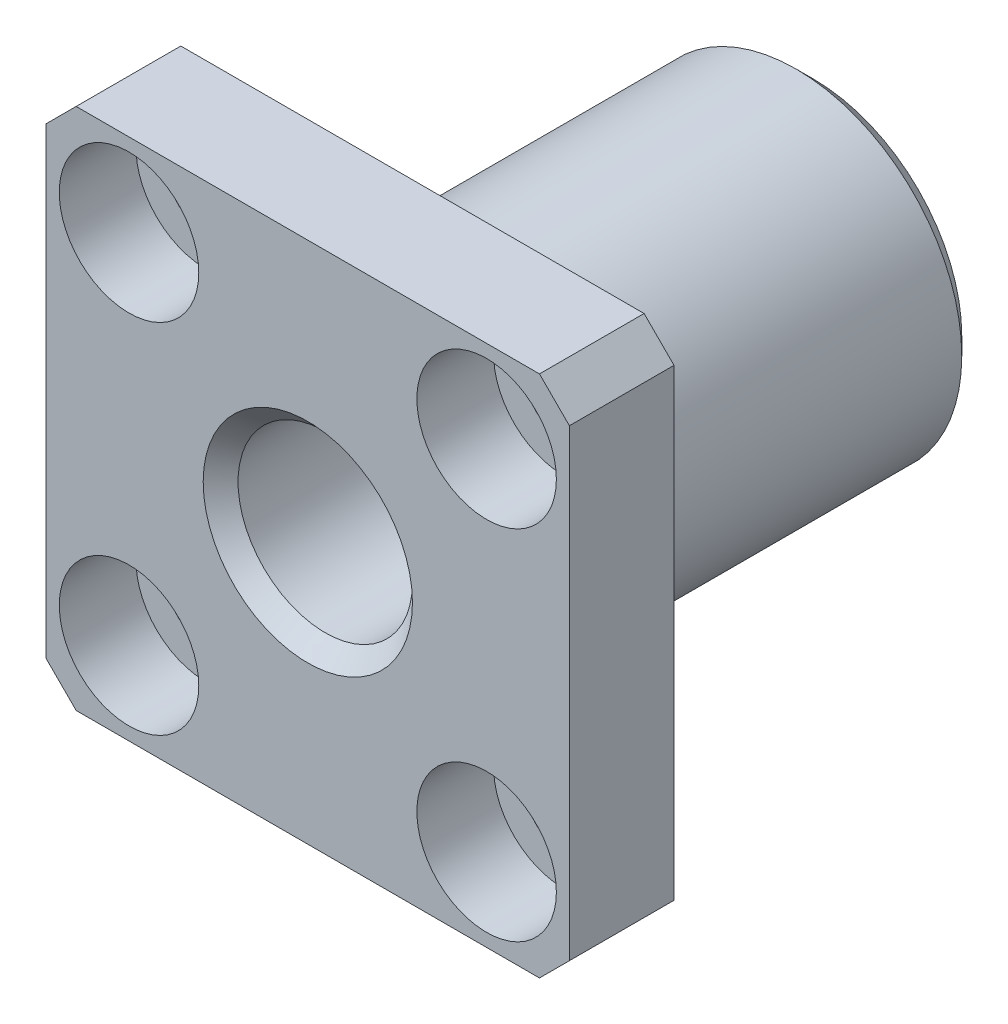
ISO-10303-21;
HEADER;
FILE_DESCRIPTION(('STEP AP214'),'2;1');
FILE_NAME('part.step','',(''),(''),'','','');
FILE_SCHEMA(('AUTOMOTIVE_DESIGN { 1 0 10303 214 1 1 1 1 }'));
ENDSEC;
DATA;
#1=APPLICATION_CONTEXT('core data for automotive mechanical design processes');
#2=APPLICATION_PROTOCOL_DEFINITION('international standard','automotive_design',2000,#1);
#3=PRODUCT_CONTEXT('',#1,'mechanical');
#4=PRODUCT('Part','Part','',(#3));
#5=PRODUCT_RELATED_PRODUCT_CATEGORY('part','',(#4));
#6=PRODUCT_DEFINITION_FORMATION('','',#4);
#7=PRODUCT_DEFINITION_CONTEXT('part definition',#1,'design');
#8=PRODUCT_DEFINITION('design','',#6,#7);
#9=PRODUCT_DEFINITION_SHAPE('','',#8);
#10=(LENGTH_UNIT() NAMED_UNIT(*) SI_UNIT(.MILLI.,.METRE.));
#11=(NAMED_UNIT(*) PLANE_ANGLE_UNIT() SI_UNIT($,.RADIAN.));
#12=(NAMED_UNIT(*) SI_UNIT($,.STERADIAN.) SOLID_ANGLE_UNIT());
#13=UNCERTAINTY_MEASURE_WITH_UNIT(LENGTH_MEASURE(1.E-05),#10,'distance_accuracy_value','');
#14=(GEOMETRIC_REPRESENTATION_CONTEXT(3) GLOBAL_UNCERTAINTY_ASSIGNED_CONTEXT((#13)) GLOBAL_UNIT_ASSIGNED_CONTEXT((#10,
#11,#12)) REPRESENTATION_CONTEXT('',''));
#15=CARTESIAN_POINT('',(0.,0.,0.));
#16=DIRECTION('',(0.,0.,1.));
#17=DIRECTION('',(1.,0.,0.));
#18=AXIS2_PLACEMENT_3D('',#15,#16,#17);
#19=CARTESIAN_POINT('',(0.,0.,29.));
#20=DIRECTION('',(0.,0.,-1.));
#21=DIRECTION('',(-1.,0.,0.));
#22=AXIS2_PLACEMENT_3D('',#19,#20,#21);
#23=CYLINDRICAL_SURFACE('',#22,9.5);
#24=CARTESIAN_POINT('',(0.,0.,1.00000000000004));
#25=DIRECTION('',(0.,0.,1.));
#26=DIRECTION('',(1.,0.,0.));
#27=AXIS2_PLACEMENT_3D('',#24,#25,#26);
#28=CIRCLE('',#27,9.5);
#29=CARTESIAN_POINT('',(-9.5,0.,1.00000000000004));
#30=VERTEX_POINT('',#29);
#31=EDGE_CURVE('E141',#30,#30,#28,.T.);
#32=CARTESIAN_POINT('',(0.,0.,23.));
#33=DIRECTION('',(0.,0.,-1.));
#34=DIRECTION('',(-1.,0.,0.));
#35=AXIS2_PLACEMENT_3D('',#32,#33,#34);
#36=CIRCLE('',#35,9.5);
#37=CARTESIAN_POINT('',(-9.5,0.,23.));
#38=VERTEX_POINT('',#37);
#39=EDGE_CURVE('E138',#38,#38,#36,.T.);
#40=CARTESIAN_POINT('',(-9.5,0.,1.00000000000004));
#41=CARTESIAN_POINT('',(-9.5,0.,1.2291666666667));
#42=CARTESIAN_POINT('',(-9.5,0.,1.45833333333337));
#43=CARTESIAN_POINT('',(-9.5,0.,1.9166666666667));
#44=CARTESIAN_POINT('',(-9.5,0.,2.14583333333337));
#45=CARTESIAN_POINT('',(-9.5,0.,2.6041666666667));
#46=CARTESIAN_POINT('',(-9.5,0.,2.83333333333337));
#47=CARTESIAN_POINT('',(-9.5,0.,3.2916666666667));
#48=CARTESIAN_POINT('',(-9.5,0.,3.52083333333337));
#49=CARTESIAN_POINT('',(-9.5,0.,3.9791666666667));
#50=CARTESIAN_POINT('',(-9.5,0.,4.20833333333337));
#51=CARTESIAN_POINT('',(-9.5,0.,4.6666666666667));
#52=CARTESIAN_POINT('',(-9.5,0.,4.89583333333337));
#53=CARTESIAN_POINT('',(-9.5,0.,5.3541666666667));
#54=CARTESIAN_POINT('',(-9.5,0.,5.58333333333336));
#55=CARTESIAN_POINT('',(-9.5,0.,6.0416666666667));
#56=CARTESIAN_POINT('',(-9.5,0.,6.27083333333336));
#57=CARTESIAN_POINT('',(-9.5,0.,6.72916666666669));
#58=CARTESIAN_POINT('',(-9.5,0.,6.95833333333336));
#59=CARTESIAN_POINT('',(-9.5,0.,7.41666666666669));
#60=CARTESIAN_POINT('',(-9.5,0.,7.64583333333336));
#61=CARTESIAN_POINT('',(-9.5,0.,8.10416666666669));
#62=CARTESIAN_POINT('',(-9.5,0.,8.33333333333336));
#63=CARTESIAN_POINT('',(-9.5,0.,8.79166666666669));
#64=CARTESIAN_POINT('',(-9.5,0.,9.02083333333336));
#65=CARTESIAN_POINT('',(-9.5,0.,9.47916666666669));
#66=CARTESIAN_POINT('',(-9.5,0.,9.70833333333336));
#67=CARTESIAN_POINT('',(-9.5,0.,10.1666666666667));
#68=CARTESIAN_POINT('',(-9.5,0.,10.3958333333334));
#69=CARTESIAN_POINT('',(-9.5,0.,10.8541666666667));
#70=CARTESIAN_POINT('',(-9.5,0.,11.0833333333334));
#71=CARTESIAN_POINT('',(-9.5,0.,11.5416666666667));
#72=CARTESIAN_POINT('',(-9.5,0.,11.7708333333334));
#73=CARTESIAN_POINT('',(-9.5,0.,12.2291666666667));
#74=CARTESIAN_POINT('',(-9.5,0.,12.4583333333334));
#75=CARTESIAN_POINT('',(-9.5,0.,12.9166666666667));
#76=CARTESIAN_POINT('',(-9.5,0.,13.1458333333334));
#77=CARTESIAN_POINT('',(-9.5,0.,13.6041666666667));
#78=CARTESIAN_POINT('',(-9.5,0.,13.8333333333333));
#79=CARTESIAN_POINT('',(-9.5,0.,14.2916666666667));
#80=CARTESIAN_POINT('',(-9.5,0.,14.5208333333333));
#81=CARTESIAN_POINT('',(-9.5,0.,14.9791666666667));
#82=CARTESIAN_POINT('',(-9.5,0.,15.2083333333333));
#83=CARTESIAN_POINT('',(-9.5,0.,15.6666666666667));
#84=CARTESIAN_POINT('',(-9.5,0.,15.8958333333333));
#85=CARTESIAN_POINT('',(-9.5,0.,16.3541666666667));
#86=CARTESIAN_POINT('',(-9.5,0.,16.5833333333333));
#87=CARTESIAN_POINT('',(-9.5,0.,17.0416666666667));
#88=CARTESIAN_POINT('',(-9.5,0.,17.2708333333333));
#89=CARTESIAN_POINT('',(-9.5,0.,17.7291666666667));
#90=CARTESIAN_POINT('',(-9.5,0.,17.9583333333333));
#91=CARTESIAN_POINT('',(-9.5,0.,18.4166666666667));
#92=CARTESIAN_POINT('',(-9.5,0.,18.6458333333333));
#93=CARTESIAN_POINT('',(-9.5,0.,19.1041666666667));
#94=CARTESIAN_POINT('',(-9.5,0.,19.3333333333333));
#95=CARTESIAN_POINT('',(-9.5,0.,19.7916666666667));
#96=CARTESIAN_POINT('',(-9.5,0.,20.0208333333333));
#97=CARTESIAN_POINT('',(-9.5,0.,20.4791666666667));
#98=CARTESIAN_POINT('',(-9.5,0.,20.7083333333333));
#99=CARTESIAN_POINT('',(-9.5,0.,21.1666666666667));
#100=CARTESIAN_POINT('',(-9.5,0.,21.3958333333333));
#101=CARTESIAN_POINT('',(-9.5,0.,21.8541666666667));
#102=CARTESIAN_POINT('',(-9.5,0.,22.0833333333333));
#103=CARTESIAN_POINT('',(-9.5,0.,22.5416666666667));
#104=CARTESIAN_POINT('',(-9.5,0.,22.7708333333333));
#105=CARTESIAN_POINT('',(-9.5,0.,23.));
#106=B_SPLINE_CURVE_WITH_KNOTS('',3,(#40,#41,#42,#43,#44,#45,#46,#47,#48,#49,#50,#51,#52,#53,
#54,#55,#56,#57,#58,#59,#60,#61,#62,#63,#64,#65,#66,#67,#68,#69,#70,#71,#72,#73,#74,#75,#76,#77,
#78,#79,#80,#81,#82,#83,#84,#85,#86,#87,#88,#89,#90,#91,#92,#93,#94,#95,#96,#97,#98,#99,#100,
#101,#102,#103,#104,#105),.UNSPECIFIED.,.F.,.F.,(4,2,2,2,2,2,2,2,2,2,2,2,2,2,2,2,2,2,2,2,2,2,2,
2,2,2,2,2,2,2,2,2,4),(0.,0.687500000000001,1.375,2.0625,2.75,3.4375,4.125,4.81249999999999,
5.49999999999999,6.18749999999999,6.87499999999999,7.56249999999999,8.24999999999999,
8.93749999999999,9.62499999999999,10.3125,11.,11.6875,12.375,13.0625,13.75,14.4375,15.125,
15.8125,16.5,17.1875,17.875,18.5625,19.25,19.9375,20.625,21.3125,22.),.UNSPECIFIED.);
#107=EDGE_CURVE('BSEAM33',#30,#38,#106,.T.);
#108=ORIENTED_EDGE('',*,*,#31,.T.);
#109=ORIENTED_EDGE('',*,*,#39,.T.);
#110=ORIENTED_EDGE('',*,*,#107,.T.);
#111=ORIENTED_EDGE('',*,*,#107,.F.);
#112=EDGE_LOOP('',(#108,#110,#109,#111));
#113=FACE_BOUND('',#112,.T.);
#114=ADVANCED_FACE('F33',(#113),#23,.T.);
#115=CARTESIAN_POINT('',(0.,0.,0.));
#116=DIRECTION('',(0.,0.,1.));
#117=DIRECTION('',(1.,0.,0.));
#118=AXIS2_PLACEMENT_3D('',#115,#116,#117);
#119=PLANE('',#118);
#120=CARTESIAN_POINT('',(0.,0.,0.));
#121=DIRECTION('',(0.,0.,1.));
#122=DIRECTION('',(1.,0.,0.));
#123=AXIS2_PLACEMENT_3D('',#120,#121,#122);
#124=CIRCLE('',#123,8.49999999999995);
#125=CARTESIAN_POINT('',(8.49999999999995,0.,0.));
#126=VERTEX_POINT('',#125);
#127=EDGE_CURVE('E164',#126,#126,#124,.F.);
#128=ORIENTED_EDGE('',*,*,#127,.T.);
#129=EDGE_LOOP('',(#128));
#130=FACE_BOUND('',#129,.T.);
#131=CARTESIAN_POINT('',(0.,0.,0.));
#132=DIRECTION('',(0.,0.,1.));
#133=DIRECTION('',(1.,0.,0.));
#134=AXIS2_PLACEMENT_3D('',#131,#132,#133);
#135=CIRCLE('',#134,5.);
#136=CARTESIAN_POINT('',(5.,0.,0.));
#137=VERTEX_POINT('',#136);
#138=EDGE_CURVE('E442',#137,#137,#135,.T.);
#139=ORIENTED_EDGE('',*,*,#138,.T.);
#140=EDGE_LOOP('',(#139));
#141=FACE_BOUND('',#140,.T.);
#142=ADVANCED_FACE('F181',(#130,#141),#119,.F.);
#143=CARTESIAN_POINT('',(15.,-15.,23.));
#144=DIRECTION('',(1.,0.,0.));
#145=DIRECTION('',(0.,0.,-1.));
#146=AXIS2_PLACEMENT_3D('',#143,#144,#145);
#147=PLANE('',#146);
#148=DIRECTION('',(0.,0.,1.));
#149=VECTOR('',#148,1.);
#150=CARTESIAN_POINT('',(15.,-13.2842712474619,0.));
#151=LINE('',#150,#149);
#152=CARTESIAN_POINT('',(15.,-13.2842712474619,23.));
#153=VERTEX_POINT('',#152);
#154=CARTESIAN_POINT('',(15.,-13.2842712474619,29.));
#155=VERTEX_POINT('',#154);
#156=EDGE_CURVE('E474',#153,#155,#151,.T.);
#157=ORIENTED_EDGE('',*,*,#156,.F.);
#158=DIRECTION('',(0.,1.,0.));
#159=VECTOR('',#158,1.);
#160=CARTESIAN_POINT('',(15.,-15.,23.));
#161=LINE('',#160,#159);
#162=CARTESIAN_POINT('',(15.,13.2842712474619,23.));
#163=VERTEX_POINT('',#162);
#164=EDGE_CURVE('E117',#153,#163,#161,.T.);
#165=ORIENTED_EDGE('',*,*,#164,.T.);
#166=DIRECTION('',(0.,0.,1.));
#167=VECTOR('',#166,1.);
#168=CARTESIAN_POINT('',(15.,13.2842712474619,0.));
#169=LINE('',#168,#167);
#170=CARTESIAN_POINT('',(15.,13.2842712474619,29.));
#171=VERTEX_POINT('',#170);
#172=EDGE_CURVE('E100',#163,#171,#169,.T.);
#173=ORIENTED_EDGE('',*,*,#172,.T.);
#174=DIRECTION('',(0.,1.,0.));
#175=VECTOR('',#174,1.);
#176=CARTESIAN_POINT('',(15.,-15.,29.));
#177=LINE('',#176,#175);
#178=EDGE_CURVE('E115',#155,#171,#177,.T.);
#179=ORIENTED_EDGE('',*,*,#178,.F.);
#180=EDGE_LOOP('',(#157,#165,#173,#179));
#181=FACE_BOUND('',#180,.T.);
#182=ADVANCED_FACE('F114',(#181),#147,.T.);
#183=CARTESIAN_POINT('',(-15.,-15.,23.));
#184=DIRECTION('',(0.,-1.,0.));
#185=DIRECTION('',(0.,0.,-1.));
#186=AXIS2_PLACEMENT_3D('',#183,#184,#185);
#187=PLANE('',#186);
#188=DIRECTION('',(0.,0.,1.));
#189=VECTOR('',#188,1.);
#190=CARTESIAN_POINT('',(-13.2842712474619,-15.,0.));
#191=LINE('',#190,#189);
#192=CARTESIAN_POINT('',(-13.2842712474619,-15.,23.));
#193=VERTEX_POINT('',#192);
#194=CARTESIAN_POINT('',(-13.2842712474619,-15.,29.));
#195=VERTEX_POINT('',#194);
#196=EDGE_CURVE('E48',#193,#195,#191,.T.);
#197=ORIENTED_EDGE('',*,*,#196,.F.);
#198=DIRECTION('',(1.,0.,0.));
#199=VECTOR('',#198,1.);
#200=CARTESIAN_POINT('',(-15.,-15.,23.));
#201=LINE('',#200,#199);
#202=CARTESIAN_POINT('',(13.2842712474619,-15.,23.));
#203=VERTEX_POINT('',#202);
#204=EDGE_CURVE('E131',#193,#203,#201,.T.);
#205=ORIENTED_EDGE('',*,*,#204,.T.);
#206=DIRECTION('',(0.,0.,1.));
#207=VECTOR('',#206,1.);
#208=CARTESIAN_POINT('',(13.2842712474619,-15.,0.));
#209=LINE('',#208,#207);
#210=CARTESIAN_POINT('',(13.2842712474619,-15.,29.));
#211=VERTEX_POINT('',#210);
#212=EDGE_CURVE('E108',#203,#211,#209,.T.);
#213=ORIENTED_EDGE('',*,*,#212,.T.);
#214=DIRECTION('',(1.,0.,0.));
#215=VECTOR('',#214,1.);
#216=CARTESIAN_POINT('',(-15.,-15.,29.));
#217=LINE('',#216,#215);
#218=EDGE_CURVE('E136',#195,#211,#217,.T.);
#219=ORIENTED_EDGE('',*,*,#218,.F.);
#220=EDGE_LOOP('',(#197,#205,#213,#219));
#221=FACE_BOUND('',#220,.T.);
#222=ADVANCED_FACE('F198',(#221),#187,.T.);
#223=CARTESIAN_POINT('',(-15.,-15.,23.));
#224=DIRECTION('',(-1.,0.,0.));
#225=DIRECTION('',(0.,0.,1.));
#226=AXIS2_PLACEMENT_3D('',#223,#224,#225);
#227=PLANE('',#226);
#228=DIRECTION('',(0.,0.,1.));
#229=VECTOR('',#228,1.);
#230=CARTESIAN_POINT('',(-15.,-13.2842712474619,0.));
#231=LINE('',#230,#229);
#232=CARTESIAN_POINT('',(-15.,-13.2842712474619,23.));
#233=VERTEX_POINT('',#232);
#234=CARTESIAN_POINT('',(-15.,-13.2842712474619,29.));
#235=VERTEX_POINT('',#234);
#236=EDGE_CURVE('E479',#233,#235,#231,.T.);
#237=ORIENTED_EDGE('',*,*,#236,.T.);
#238=DIRECTION('',(0.,-1.,0.));
#239=VECTOR('',#238,1.);
#240=CARTESIAN_POINT('',(-15.,-15.,29.));
#241=LINE('',#240,#239);
#242=CARTESIAN_POINT('',(-15.,13.2842712474619,29.));
#243=VERTEX_POINT('',#242);
#244=EDGE_CURVE('E126',#243,#235,#241,.T.);
#245=ORIENTED_EDGE('',*,*,#244,.F.);
#246=DIRECTION('',(0.,0.,1.));
#247=VECTOR('',#246,1.);
#248=CARTESIAN_POINT('',(-15.,13.2842712474619,0.));
#249=LINE('',#248,#247);
#250=CARTESIAN_POINT('',(-15.,13.2842712474619,23.));
#251=VERTEX_POINT('',#250);
#252=EDGE_CURVE('E56',#251,#243,#249,.T.);
#253=ORIENTED_EDGE('',*,*,#252,.F.);
#254=DIRECTION('',(0.,-1.,0.));
#255=VECTOR('',#254,1.);
#256=CARTESIAN_POINT('',(-15.,-15.,23.));
#257=LINE('',#256,#255);
#258=EDGE_CURVE('E496',#251,#233,#257,.T.);
#259=ORIENTED_EDGE('',*,*,#258,.T.);
#260=EDGE_LOOP('',(#237,#245,#253,#259));
#261=FACE_BOUND('',#260,.T.);
#262=ADVANCED_FACE('F202',(#261),#227,.T.);
#263=CARTESIAN_POINT('',(-15.,15.,23.));
#264=DIRECTION('',(0.,1.,0.));
#265=DIRECTION('',(0.,0.,1.));
#266=AXIS2_PLACEMENT_3D('',#263,#264,#265);
#267=PLANE('',#266);
#268=DIRECTION('',(0.,0.,1.));
#269=VECTOR('',#268,1.);
#270=CARTESIAN_POINT('',(13.2842712474619,15.,0.));
#271=LINE('',#270,#269);
#272=CARTESIAN_POINT('',(13.2842712474619,15.,23.));
#273=VERTEX_POINT('',#272);
#274=CARTESIAN_POINT('',(13.2842712474619,15.,29.));
#275=VERTEX_POINT('',#274);
#276=EDGE_CURVE('E103',#273,#275,#271,.T.);
#277=ORIENTED_EDGE('',*,*,#276,.F.);
#278=DIRECTION('',(-1.,0.,0.));
#279=VECTOR('',#278,1.);
#280=CARTESIAN_POINT('',(-15.,15.,23.));
#281=LINE('',#280,#279);
#282=CARTESIAN_POINT('',(-13.2842712474619,15.,23.));
#283=VERTEX_POINT('',#282);
#284=EDGE_CURVE('E494',#273,#283,#281,.T.);
#285=ORIENTED_EDGE('',*,*,#284,.T.);
#286=DIRECTION('',(0.,0.,1.));
#287=VECTOR('',#286,1.);
#288=CARTESIAN_POINT('',(-13.2842712474619,15.,0.));
#289=LINE('',#288,#287);
#290=CARTESIAN_POINT('',(-13.2842712474619,15.,29.));
#291=VERTEX_POINT('',#290);
#292=EDGE_CURVE('E484',#283,#291,#289,.T.);
#293=ORIENTED_EDGE('',*,*,#292,.T.);
#294=DIRECTION('',(-1.,0.,0.));
#295=VECTOR('',#294,1.);
#296=CARTESIAN_POINT('',(-15.,15.,29.));
#297=LINE('',#296,#295);
#298=EDGE_CURVE('E123',#275,#291,#297,.T.);
#299=ORIENTED_EDGE('',*,*,#298,.F.);
#300=EDGE_LOOP('',(#277,#285,#293,#299));
#301=FACE_BOUND('',#300,.T.);
#302=ADVANCED_FACE('F199',(#301),#267,.T.);
#303=CARTESIAN_POINT('',(0.,0.,23.));
#304=DIRECTION('',(0.,0.,-1.));
#305=DIRECTION('',(-1.,0.,0.));
#306=AXIS2_PLACEMENT_3D('',#303,#304,#305);
#307=PLANE('',#306);
#308=CARTESIAN_POINT('',(-10.2530483272049,10.2530483272049,23.));
#309=DIRECTION('',(0.,0.,-1.));
#310=DIRECTION('',(-1.,0.,0.));
#311=AXIS2_PLACEMENT_3D('',#308,#309,#310);
#312=CIRCLE('',#311,2.25);
#313=CARTESIAN_POINT('',(-12.5030483272049,10.2530483272049,23.));
#314=VERTEX_POINT('',#313);
#315=EDGE_CURVE('E157',#314,#314,#312,.T.);
#316=ORIENTED_EDGE('',*,*,#315,.F.);
#317=EDGE_LOOP('',(#316));
#318=FACE_BOUND('',#317,.T.);
#319=CARTESIAN_POINT('',(10.2530483272049,10.2530483272049,23.));
#320=DIRECTION('',(0.,0.,-1.));
#321=DIRECTION('',(-1.,0.,0.));
#322=AXIS2_PLACEMENT_3D('',#319,#320,#321);
#323=CIRCLE('',#322,2.25);
#324=CARTESIAN_POINT('',(8.00304832720494,10.2530483272049,23.));
#325=VERTEX_POINT('',#324);
#326=EDGE_CURVE('E152',#325,#325,#323,.T.);
#327=ORIENTED_EDGE('',*,*,#326,.F.);
#328=EDGE_LOOP('',(#327));
#329=FACE_BOUND('',#328,.T.);
#330=CARTESIAN_POINT('',(10.2530483272049,-10.2530483272049,23.));
#331=DIRECTION('',(0.,0.,-1.));
#332=DIRECTION('',(-1.,0.,0.));
#333=AXIS2_PLACEMENT_3D('',#330,#331,#332);
#334=CIRCLE('',#333,2.25);
#335=CARTESIAN_POINT('',(8.00304832720494,-10.2530483272049,23.));
#336=VERTEX_POINT('',#335);
#337=EDGE_CURVE('E147',#336,#336,#334,.T.);
#338=ORIENTED_EDGE('',*,*,#337,.F.);
#339=EDGE_LOOP('',(#338));
#340=FACE_BOUND('',#339,.T.);
#341=CARTESIAN_POINT('',(-10.2530483272049,-10.2530483272049,23.));
#342=DIRECTION('',(0.,0.,-1.));
#343=DIRECTION('',(-1.,0.,0.));
#344=AXIS2_PLACEMENT_3D('',#341,#342,#343);
#345=CIRCLE('',#344,2.25);
#346=CARTESIAN_POINT('',(-12.5030483272049,-10.2530483272049,23.));
#347=VERTEX_POINT('',#346);
#348=EDGE_CURVE('E142',#347,#347,#345,.T.);
#349=ORIENTED_EDGE('',*,*,#348,.F.);
#350=EDGE_LOOP('',(#349));
#351=FACE_BOUND('',#350,.T.);
#352=DIRECTION('',(0.707106781186548,-0.707106781186548,0.));
#353=VECTOR('',#352,1.);
#354=CARTESIAN_POINT('',(-14.142135623731,-14.142135623731,23.));
#355=LINE('',#354,#353);
#356=EDGE_CURVE('E124',#233,#193,#355,.T.);
#357=ORIENTED_EDGE('',*,*,#356,.F.);
#358=ORIENTED_EDGE('',*,*,#258,.F.);
#359=DIRECTION('',(-0.707106781186548,-0.707106781186548,0.));
#360=VECTOR('',#359,1.);
#361=CARTESIAN_POINT('',(-14.142135623731,14.142135623731,23.));
#362=LINE('',#361,#360);
#363=EDGE_CURVE('E487',#283,#251,#362,.T.);
#364=ORIENTED_EDGE('',*,*,#363,.F.);
#365=ORIENTED_EDGE('',*,*,#284,.F.);
#366=DIRECTION('',(-0.707106781186548,0.707106781186548,0.));
#367=VECTOR('',#366,1.);
#368=CARTESIAN_POINT('',(14.142135623731,14.142135623731,23.));
#369=LINE('',#368,#367);
#370=EDGE_CURVE('E490',#163,#273,#369,.T.);
#371=ORIENTED_EDGE('',*,*,#370,.F.);
#372=ORIENTED_EDGE('',*,*,#164,.F.);
#373=DIRECTION('',(0.707106781186548,0.707106781186548,0.));
#374=VECTOR('',#373,1.);
#375=CARTESIAN_POINT('',(14.142135623731,-14.142135623731,23.));
#376=LINE('',#375,#374);
#377=EDGE_CURVE('E128',#203,#153,#376,.T.);
#378=ORIENTED_EDGE('',*,*,#377,.F.);
#379=ORIENTED_EDGE('',*,*,#204,.F.);
#380=EDGE_LOOP('',(#357,#358,#364,#365,#371,#372,#378,#379));
#381=FACE_BOUND('',#380,.T.);
#382=ORIENTED_EDGE('',*,*,#39,.F.);
#383=EDGE_LOOP('',(#382));
#384=FACE_BOUND('',#383,.T.);
#385=ADVANCED_FACE('F194',(#318,#329,#340,#351,#381,#384),#307,.T.);
#386=CARTESIAN_POINT('',(0.,0.,29.));
#387=DIRECTION('',(0.,0.,1.));
#388=DIRECTION('',(1.,0.,0.));
#389=AXIS2_PLACEMENT_3D('',#386,#387,#388);
#390=PLANE('',#389);
#391=CARTESIAN_POINT('',(0.,0.,29.));
#392=DIRECTION('',(0.,0.,1.));
#393=DIRECTION('',(1.,0.,0.));
#394=AXIS2_PLACEMENT_3D('',#391,#392,#393);
#395=CIRCLE('',#394,6.00000000000005);
#396=CARTESIAN_POINT('',(6.00000000000005,0.,29.));
#397=VERTEX_POINT('',#396);
#398=EDGE_CURVE('E11',#397,#397,#395,.F.);
#399=ORIENTED_EDGE('',*,*,#398,.T.);
#400=EDGE_LOOP('',(#399));
#401=FACE_BOUND('',#400,.T.);
#402=CARTESIAN_POINT('',(-10.2530483272049,10.2530483272049,29.));
#403=DIRECTION('',(0.,0.,1.));
#404=DIRECTION('',(1.,0.,0.));
#405=AXIS2_PLACEMENT_3D('',#402,#403,#404);
#406=CIRCLE('',#405,4.);
#407=CARTESIAN_POINT('',(-6.25304832720494,10.2530483272049,29.));
#408=VERTEX_POINT('',#407);
#409=EDGE_CURVE('E440',#408,#408,#406,.T.);
#410=ORIENTED_EDGE('',*,*,#409,.F.);
#411=EDGE_LOOP('',(#410));
#412=FACE_BOUND('',#411,.T.);
#413=CARTESIAN_POINT('',(10.2530483272049,10.2530483272049,29.));
#414=DIRECTION('',(0.,0.,1.));
#415=DIRECTION('',(1.,0.,0.));
#416=AXIS2_PLACEMENT_3D('',#413,#414,#415);
#417=CIRCLE('',#416,4.);
#418=CARTESIAN_POINT('',(14.2530483272049,10.2530483272049,29.));
#419=VERTEX_POINT('',#418);
#420=EDGE_CURVE('E160',#419,#419,#417,.T.);
#421=ORIENTED_EDGE('',*,*,#420,.F.);
#422=EDGE_LOOP('',(#421));
#423=FACE_BOUND('',#422,.T.);
#424=CARTESIAN_POINT('',(10.2530483272049,-10.2530483272049,29.));
#425=DIRECTION('',(0.,0.,1.));
#426=DIRECTION('',(1.,0.,0.));
#427=AXIS2_PLACEMENT_3D('',#424,#425,#426);
#428=CIRCLE('',#427,4.);
#429=CARTESIAN_POINT('',(14.2530483272049,-10.2530483272049,29.));
#430=VERTEX_POINT('',#429);
#431=EDGE_CURVE('E155',#430,#430,#428,.T.);
#432=ORIENTED_EDGE('',*,*,#431,.F.);
#433=EDGE_LOOP('',(#432));
#434=FACE_BOUND('',#433,.T.);
#435=CARTESIAN_POINT('',(-10.2530483272049,-10.2530483272049,29.));
#436=DIRECTION('',(0.,0.,1.));
#437=DIRECTION('',(1.,0.,0.));
#438=AXIS2_PLACEMENT_3D('',#435,#436,#437);
#439=CIRCLE('',#438,4.);
#440=CARTESIAN_POINT('',(-6.25304832720494,-10.2530483272049,29.));
#441=VERTEX_POINT('',#440);
#442=EDGE_CURVE('E150',#441,#441,#439,.T.);
#443=ORIENTED_EDGE('',*,*,#442,.F.);
#444=EDGE_LOOP('',(#443));
#445=FACE_BOUND('',#444,.T.);
#446=DIRECTION('',(-0.707106781186548,0.707106781186548,0.));
#447=VECTOR('',#446,1.);
#448=CARTESIAN_POINT('',(-15.,-13.2842712474619,29.));
#449=LINE('',#448,#447);
#450=EDGE_CURVE('E145',#195,#235,#449,.T.);
#451=ORIENTED_EDGE('',*,*,#450,.F.);
#452=ORIENTED_EDGE('',*,*,#218,.T.);
#453=DIRECTION('',(-0.707106781186548,-0.707106781186548,0.));
#454=VECTOR('',#453,1.);
#455=CARTESIAN_POINT('',(15.,-13.2842712474619,29.));
#456=LINE('',#455,#454);
#457=EDGE_CURVE('E122',#155,#211,#456,.T.);
#458=ORIENTED_EDGE('',*,*,#457,.F.);
#459=ORIENTED_EDGE('',*,*,#178,.T.);
#460=DIRECTION('',(0.707106781186548,-0.707106781186548,0.));
#461=VECTOR('',#460,1.);
#462=CARTESIAN_POINT('',(15.,13.2842712474619,29.));
#463=LINE('',#462,#461);
#464=EDGE_CURVE('E97',#275,#171,#463,.T.);
#465=ORIENTED_EDGE('',*,*,#464,.F.);
#466=ORIENTED_EDGE('',*,*,#298,.T.);
#467=DIRECTION('',(0.707106781186548,0.707106781186548,0.));
#468=VECTOR('',#467,1.);
#469=CARTESIAN_POINT('',(-15.,13.2842712474619,29.));
#470=LINE('',#469,#468);
#471=EDGE_CURVE('E471',#243,#291,#470,.T.);
#472=ORIENTED_EDGE('',*,*,#471,.F.);
#473=ORIENTED_EDGE('',*,*,#244,.T.);
#474=EDGE_LOOP('',(#451,#452,#458,#459,#465,#466,#472,#473));
#475=FACE_BOUND('',#474,.T.);
#476=ADVANCED_FACE('F120',(#401,#412,#423,#434,#445,#475),#390,.T.);
#477=CARTESIAN_POINT('',(-15.,13.2842712474619,0.));
#478=DIRECTION('',(0.707106781186548,-0.707106781186548,0.));
#479=DIRECTION('',(0.707106781186548,0.707106781186548,0.));
#480=AXIS2_PLACEMENT_3D('',#477,#478,#479);
#481=PLANE('',#480);
#482=ORIENTED_EDGE('',*,*,#363,.T.);
#483=ORIENTED_EDGE('',*,*,#252,.T.);
#484=ORIENTED_EDGE('',*,*,#471,.T.);
#485=ORIENTED_EDGE('',*,*,#292,.F.);
#486=EDGE_LOOP('',(#482,#483,#484,#485));
#487=FACE_BOUND('',#486,.T.);
#488=ADVANCED_FACE('F193',(#487),#481,.F.);
#489=CARTESIAN_POINT('',(15.,13.2842712474619,0.));
#490=DIRECTION('',(-0.707106781186548,-0.707106781186548,0.));
#491=DIRECTION('',(0.707106781186548,-0.707106781186548,0.));
#492=AXIS2_PLACEMENT_3D('',#489,#490,#491);
#493=PLANE('',#492);
#494=ORIENTED_EDGE('',*,*,#370,.T.);
#495=ORIENTED_EDGE('',*,*,#276,.T.);
#496=ORIENTED_EDGE('',*,*,#464,.T.);
#497=ORIENTED_EDGE('',*,*,#172,.F.);
#498=EDGE_LOOP('',(#494,#495,#496,#497));
#499=FACE_BOUND('',#498,.T.);
#500=ADVANCED_FACE('F99',(#499),#493,.F.);
#501=CARTESIAN_POINT('',(15.,-13.2842712474619,0.));
#502=DIRECTION('',(-0.707106781186548,0.707106781186548,0.));
#503=DIRECTION('',(-0.707106781186548,-0.707106781186548,0.));
#504=AXIS2_PLACEMENT_3D('',#501,#502,#503);
#505=PLANE('',#504);
#506=ORIENTED_EDGE('',*,*,#377,.T.);
#507=ORIENTED_EDGE('',*,*,#156,.T.);
#508=ORIENTED_EDGE('',*,*,#457,.T.);
#509=ORIENTED_EDGE('',*,*,#212,.F.);
#510=EDGE_LOOP('',(#506,#507,#508,#509));
#511=FACE_BOUND('',#510,.T.);
#512=ADVANCED_FACE('F219',(#511),#505,.F.);
#513=CARTESIAN_POINT('',(-15.,-13.2842712474619,0.));
#514=DIRECTION('',(0.707106781186548,0.707106781186548,0.));
#515=DIRECTION('',(-0.707106781186548,0.707106781186548,0.));
#516=AXIS2_PLACEMENT_3D('',#513,#514,#515);
#517=PLANE('',#516);
#518=ORIENTED_EDGE('',*,*,#356,.T.);
#519=ORIENTED_EDGE('',*,*,#196,.T.);
#520=ORIENTED_EDGE('',*,*,#450,.T.);
#521=ORIENTED_EDGE('',*,*,#236,.F.);
#522=EDGE_LOOP('',(#518,#519,#520,#521));
#523=FACE_BOUND('',#522,.T.);
#524=ADVANCED_FACE('F215',(#523),#517,.F.);
#525=CARTESIAN_POINT('',(-10.2530483272049,-10.2530483272049,29.));
#526=DIRECTION('',(0.,0.,1.));
#527=DIRECTION('',(1.,0.,0.));
#528=AXIS2_PLACEMENT_3D('',#525,#526,#527);
#529=CYLINDRICAL_SURFACE('',#528,2.25);
#530=ORIENTED_EDGE('',*,*,#348,.T.);
#531=EDGE_LOOP('',(#530));
#532=FACE_BOUND('',#531,.T.);
#533=CARTESIAN_POINT('',(-10.2530483272049,-10.2530483272049,24.6));
#534=DIRECTION('',(0.,0.,1.));
#535=DIRECTION('',(1.,0.,0.));
#536=AXIS2_PLACEMENT_3D('',#533,#534,#535);
#537=CIRCLE('',#536,2.25);
#538=CARTESIAN_POINT('',(-8.00304832720494,-10.2530483272049,24.6));
#539=VERTEX_POINT('',#538);
#540=EDGE_CURVE('E146',#539,#539,#537,.T.);
#541=ORIENTED_EDGE('',*,*,#540,.T.);
#542=EDGE_LOOP('',(#541));
#543=FACE_BOUND('',#542,.T.);
#544=ADVANCED_FACE('F218',(#532,#543),#529,.F.);
#545=CARTESIAN_POINT('',(-8.00304832720494,-10.2530483272049,24.6));
#546=DIRECTION('',(0.,0.,-1.));
#547=DIRECTION('',(-1.,0.,0.));
#548=AXIS2_PLACEMENT_3D('',#545,#546,#547);
#549=PLANE('',#548);
#550=ORIENTED_EDGE('',*,*,#540,.F.);
#551=EDGE_LOOP('',(#550));
#552=FACE_BOUND('',#551,.T.);
#553=CARTESIAN_POINT('',(-10.2530483272049,-10.2530483272049,24.6));
#554=DIRECTION('',(0.,0.,1.));
#555=DIRECTION('',(1.,0.,0.));
#556=AXIS2_PLACEMENT_3D('',#553,#554,#555);
#557=CIRCLE('',#556,4.);
#558=CARTESIAN_POINT('',(-6.25304832720494,-10.2530483272049,24.6));
#559=VERTEX_POINT('',#558);
#560=EDGE_CURVE('E466',#559,#559,#557,.T.);
#561=ORIENTED_EDGE('',*,*,#560,.T.);
#562=EDGE_LOOP('',(#561));
#563=FACE_BOUND('',#562,.T.);
#564=ADVANCED_FACE('F227',(#552,#563),#549,.F.);
#565=CARTESIAN_POINT('',(-10.2530483272049,-10.2530483272049,29.));
#566=DIRECTION('',(0.,0.,1.));
#567=DIRECTION('',(1.,0.,0.));
#568=AXIS2_PLACEMENT_3D('',#565,#566,#567);
#569=CYLINDRICAL_SURFACE('',#568,4.);
#570=ORIENTED_EDGE('',*,*,#560,.F.);
#571=EDGE_LOOP('',(#570));
#572=FACE_BOUND('',#571,.T.);
#573=ORIENTED_EDGE('',*,*,#442,.T.);
#574=EDGE_LOOP('',(#573));
#575=FACE_BOUND('',#574,.T.);
#576=ADVANCED_FACE('F231',(#572,#575),#569,.F.);
#577=CARTESIAN_POINT('',(10.2530483272049,-10.2530483272049,29.));
#578=DIRECTION('',(0.,0.,1.));
#579=DIRECTION('',(1.,0.,0.));
#580=AXIS2_PLACEMENT_3D('',#577,#578,#579);
#581=CYLINDRICAL_SURFACE('',#580,2.25);
#582=ORIENTED_EDGE('',*,*,#337,.T.);
#583=EDGE_LOOP('',(#582));
#584=FACE_BOUND('',#583,.T.);
#585=CARTESIAN_POINT('',(10.2530483272049,-10.2530483272049,24.6));
#586=DIRECTION('',(0.,0.,1.));
#587=DIRECTION('',(1.,0.,0.));
#588=AXIS2_PLACEMENT_3D('',#585,#586,#587);
#589=CIRCLE('',#588,2.25);
#590=CARTESIAN_POINT('',(12.5030483272049,-10.2530483272049,24.6));
#591=VERTEX_POINT('',#590);
#592=EDGE_CURVE('E151',#591,#591,#589,.T.);
#593=ORIENTED_EDGE('',*,*,#592,.T.);
#594=EDGE_LOOP('',(#593));
#595=FACE_BOUND('',#594,.T.);
#596=ADVANCED_FACE('F235',(#584,#595),#581,.F.);
#597=CARTESIAN_POINT('',(12.5030483272049,-10.2530483272049,24.6));
#598=DIRECTION('',(0.,0.,-1.));
#599=DIRECTION('',(-1.,0.,0.));
#600=AXIS2_PLACEMENT_3D('',#597,#598,#599);
#601=PLANE('',#600);
#602=ORIENTED_EDGE('',*,*,#592,.F.);
#603=EDGE_LOOP('',(#602));
#604=FACE_BOUND('',#603,.T.);
#605=CARTESIAN_POINT('',(10.2530483272049,-10.2530483272049,24.6));
#606=DIRECTION('',(0.,0.,1.));
#607=DIRECTION('',(1.,0.,0.));
#608=AXIS2_PLACEMENT_3D('',#605,#606,#607);
#609=CIRCLE('',#608,4.);
#610=CARTESIAN_POINT('',(14.2530483272049,-10.2530483272049,24.6));
#611=VERTEX_POINT('',#610);
#612=EDGE_CURVE('E459',#611,#611,#609,.T.);
#613=ORIENTED_EDGE('',*,*,#612,.T.);
#614=EDGE_LOOP('',(#613));
#615=FACE_BOUND('',#614,.T.);
#616=ADVANCED_FACE('F239',(#604,#615),#601,.F.);
#617=CARTESIAN_POINT('',(10.2530483272049,-10.2530483272049,29.));
#618=DIRECTION('',(0.,0.,1.));
#619=DIRECTION('',(1.,0.,0.));
#620=AXIS2_PLACEMENT_3D('',#617,#618,#619);
#621=CYLINDRICAL_SURFACE('',#620,4.);
#622=ORIENTED_EDGE('',*,*,#612,.F.);
#623=EDGE_LOOP('',(#622));
#624=FACE_BOUND('',#623,.T.);
#625=ORIENTED_EDGE('',*,*,#431,.T.);
#626=EDGE_LOOP('',(#625));
#627=FACE_BOUND('',#626,.T.);
#628=ADVANCED_FACE('F243',(#624,#627),#621,.F.);
#629=CARTESIAN_POINT('',(10.2530483272049,10.2530483272049,29.));
#630=DIRECTION('',(0.,0.,1.));
#631=DIRECTION('',(1.,0.,0.));
#632=AXIS2_PLACEMENT_3D('',#629,#630,#631);
#633=CYLINDRICAL_SURFACE('',#632,2.25);
#634=ORIENTED_EDGE('',*,*,#326,.T.);
#635=EDGE_LOOP('',(#634));
#636=FACE_BOUND('',#635,.T.);
#637=CARTESIAN_POINT('',(10.2530483272049,10.2530483272049,24.6));
#638=DIRECTION('',(0.,0.,1.));
#639=DIRECTION('',(1.,0.,0.));
#640=AXIS2_PLACEMENT_3D('',#637,#638,#639);
#641=CIRCLE('',#640,2.25);
#642=CARTESIAN_POINT('',(12.5030483272049,10.2530483272049,24.6));
#643=VERTEX_POINT('',#642);
#644=EDGE_CURVE('E156',#643,#643,#641,.T.);
#645=ORIENTED_EDGE('',*,*,#644,.T.);
#646=EDGE_LOOP('',(#645));
#647=FACE_BOUND('',#646,.T.);
#648=ADVANCED_FACE('F247',(#636,#647),#633,.F.);
#649=CARTESIAN_POINT('',(12.5030483272049,10.2530483272049,24.6));
#650=DIRECTION('',(0.,0.,-1.));
#651=DIRECTION('',(-1.,0.,0.));
#652=AXIS2_PLACEMENT_3D('',#649,#650,#651);
#653=PLANE('',#652);
#654=ORIENTED_EDGE('',*,*,#644,.F.);
#655=EDGE_LOOP('',(#654));
#656=FACE_BOUND('',#655,.T.);
#657=CARTESIAN_POINT('',(10.2530483272049,10.2530483272049,24.6));
#658=DIRECTION('',(0.,0.,1.));
#659=DIRECTION('',(1.,0.,0.));
#660=AXIS2_PLACEMENT_3D('',#657,#658,#659);
#661=CIRCLE('',#660,4.);
#662=CARTESIAN_POINT('',(14.2530483272049,10.2530483272049,24.6));
#663=VERTEX_POINT('',#662);
#664=EDGE_CURVE('E452',#663,#663,#661,.T.);
#665=ORIENTED_EDGE('',*,*,#664,.T.);
#666=EDGE_LOOP('',(#665));
#667=FACE_BOUND('',#666,.T.);
#668=ADVANCED_FACE('F251',(#656,#667),#653,.F.);
#669=CARTESIAN_POINT('',(10.2530483272049,10.2530483272049,29.));
#670=DIRECTION('',(0.,0.,1.));
#671=DIRECTION('',(1.,0.,0.));
#672=AXIS2_PLACEMENT_3D('',#669,#670,#671);
#673=CYLINDRICAL_SURFACE('',#672,4.);
#674=ORIENTED_EDGE('',*,*,#664,.F.);
#675=EDGE_LOOP('',(#674));
#676=FACE_BOUND('',#675,.T.);
#677=ORIENTED_EDGE('',*,*,#420,.T.);
#678=EDGE_LOOP('',(#677));
#679=FACE_BOUND('',#678,.T.);
#680=ADVANCED_FACE('F255',(#676,#679),#673,.F.);
#681=CARTESIAN_POINT('',(-10.2530483272049,10.2530483272049,29.));
#682=DIRECTION('',(0.,0.,1.));
#683=DIRECTION('',(1.,0.,0.));
#684=AXIS2_PLACEMENT_3D('',#681,#682,#683);
#685=CYLINDRICAL_SURFACE('',#684,2.25);
#686=ORIENTED_EDGE('',*,*,#315,.T.);
#687=EDGE_LOOP('',(#686));
#688=FACE_BOUND('',#687,.T.);
#689=CARTESIAN_POINT('',(-10.2530483272049,10.2530483272049,24.6));
#690=DIRECTION('',(0.,0.,1.));
#691=DIRECTION('',(1.,0.,0.));
#692=AXIS2_PLACEMENT_3D('',#689,#690,#691);
#693=CIRCLE('',#692,2.25);
#694=CARTESIAN_POINT('',(-8.00304832720494,10.2530483272049,24.6));
#695=VERTEX_POINT('',#694);
#696=EDGE_CURVE('E161',#695,#695,#693,.T.);
#697=ORIENTED_EDGE('',*,*,#696,.T.);
#698=EDGE_LOOP('',(#697));
#699=FACE_BOUND('',#698,.T.);
#700=ADVANCED_FACE('F259',(#688,#699),#685,.F.);
#701=CARTESIAN_POINT('',(-8.00304832720494,10.2530483272049,24.6));
#702=DIRECTION('',(0.,0.,-1.));
#703=DIRECTION('',(-1.,0.,0.));
#704=AXIS2_PLACEMENT_3D('',#701,#702,#703);
#705=PLANE('',#704);
#706=ORIENTED_EDGE('',*,*,#696,.F.);
#707=EDGE_LOOP('',(#706));
#708=FACE_BOUND('',#707,.T.);
#709=CARTESIAN_POINT('',(-10.2530483272049,10.2530483272049,24.6));
#710=DIRECTION('',(0.,0.,1.));
#711=DIRECTION('',(1.,0.,0.));
#712=AXIS2_PLACEMENT_3D('',#709,#710,#711);
#713=CIRCLE('',#712,4.);
#714=CARTESIAN_POINT('',(-6.25304832720494,10.2530483272049,24.6));
#715=VERTEX_POINT('',#714);
#716=EDGE_CURVE('E437',#715,#715,#713,.T.);
#717=ORIENTED_EDGE('',*,*,#716,.T.);
#718=EDGE_LOOP('',(#717));
#719=FACE_BOUND('',#718,.T.);
#720=ADVANCED_FACE('F263',(#708,#719),#705,.F.);
#721=CARTESIAN_POINT('',(-10.2530483272049,10.2530483272049,29.));
#722=DIRECTION('',(0.,0.,1.));
#723=DIRECTION('',(1.,0.,0.));
#724=AXIS2_PLACEMENT_3D('',#721,#722,#723);
#725=CYLINDRICAL_SURFACE('',#724,4.);
#726=ORIENTED_EDGE('',*,*,#716,.F.);
#727=EDGE_LOOP('',(#726));
#728=FACE_BOUND('',#727,.T.);
#729=ORIENTED_EDGE('',*,*,#409,.T.);
#730=EDGE_LOOP('',(#729));
#731=FACE_BOUND('',#730,.T.);
#732=ADVANCED_FACE('F267',(#728,#731),#725,.F.);
#733=CARTESIAN_POINT('',(0.,0.,0.));
#734=DIRECTION('',(0.,0.,1.));
#735=DIRECTION('',(1.,0.,0.));
#736=AXIS2_PLACEMENT_3D('',#733,#734,#735);
#737=CYLINDRICAL_SURFACE('',#736,5.);
#738=CARTESIAN_POINT('',(0.,0.,28.));
#739=DIRECTION('',(0.,0.,1.));
#740=DIRECTION('',(1.,0.,0.));
#741=AXIS2_PLACEMENT_3D('',#738,#739,#740);
#742=CIRCLE('',#741,5.);
#743=CARTESIAN_POINT('',(5.,0.,28.));
#744=VERTEX_POINT('',#743);
#745=EDGE_CURVE('E41',#744,#744,#742,.T.);
#746=CARTESIAN_POINT('',(5.,0.,28.));
#747=CARTESIAN_POINT('',(5.,0.,27.7083333333333));
#748=CARTESIAN_POINT('',(5.,0.,27.4166666666666));
#749=CARTESIAN_POINT('',(5.,0.,26.8333333333333));
#750=CARTESIAN_POINT('',(5.,0.,26.5416666666666));
#751=CARTESIAN_POINT('',(5.,0.,25.9583333333333));
#752=CARTESIAN_POINT('',(5.,0.,25.6666666666666));
#753=CARTESIAN_POINT('',(5.,0.,25.0833333333333));
#754=CARTESIAN_POINT('',(5.,0.,24.7916666666666));
#755=CARTESIAN_POINT('',(5.,0.,24.2083333333333));
#756=CARTESIAN_POINT('',(5.,0.,23.9166666666666));
#757=CARTESIAN_POINT('',(5.,0.,23.3333333333333));
#758=CARTESIAN_POINT('',(5.,0.,23.0416666666666));
#759=CARTESIAN_POINT('',(5.,0.,22.4583333333333));
#760=CARTESIAN_POINT('',(5.,0.,22.1666666666666));
#761=CARTESIAN_POINT('',(5.,0.,21.5833333333333));
#762=CARTESIAN_POINT('',(5.,0.,21.2916666666666));
#763=CARTESIAN_POINT('',(5.,0.,20.7083333333333));
#764=CARTESIAN_POINT('',(5.,0.,20.4166666666666));
#765=CARTESIAN_POINT('',(5.,0.,19.8333333333333));
#766=CARTESIAN_POINT('',(5.,0.,19.5416666666666));
#767=CARTESIAN_POINT('',(5.,0.,18.9583333333333));
#768=CARTESIAN_POINT('',(5.,0.,18.6666666666666));
#769=CARTESIAN_POINT('',(5.,0.,18.0833333333333));
#770=CARTESIAN_POINT('',(5.,0.,17.7916666666666));
#771=CARTESIAN_POINT('',(5.,0.,17.2083333333333));
#772=CARTESIAN_POINT('',(5.,0.,16.9166666666666));
#773=CARTESIAN_POINT('',(5.,0.,16.3333333333333));
#774=CARTESIAN_POINT('',(5.,0.,16.0416666666666));
#775=CARTESIAN_POINT('',(5.,0.,15.4583333333333));
#776=CARTESIAN_POINT('',(5.,0.,15.1666666666666));
#777=CARTESIAN_POINT('',(5.,0.,14.5833333333333));
#778=CARTESIAN_POINT('',(5.,0.,14.2916666666666));
#779=CARTESIAN_POINT('',(5.,0.,13.7083333333333));
#780=CARTESIAN_POINT('',(5.,0.,13.4166666666666));
#781=CARTESIAN_POINT('',(5.,0.,12.8333333333333));
#782=CARTESIAN_POINT('',(5.,0.,12.5416666666666));
#783=CARTESIAN_POINT('',(5.,0.,11.9583333333333));
#784=CARTESIAN_POINT('',(5.,0.,11.6666666666667));
#785=CARTESIAN_POINT('',(5.,0.,11.0833333333333));
#786=CARTESIAN_POINT('',(5.,0.,10.7916666666667));
#787=CARTESIAN_POINT('',(5.,0.,10.2083333333333));
#788=CARTESIAN_POINT('',(5.,0.,9.91666666666665));
#789=CARTESIAN_POINT('',(5.,0.,9.33333333333332));
#790=CARTESIAN_POINT('',(5.,0.,9.04166666666665));
#791=CARTESIAN_POINT('',(5.,0.,8.45833333333332));
#792=CARTESIAN_POINT('',(5.,0.,8.16666666666665));
#793=CARTESIAN_POINT('',(5.,0.,7.58333333333332));
#794=CARTESIAN_POINT('',(5.,0.,7.29166666666666));
#795=CARTESIAN_POINT('',(5.,0.,6.70833333333333));
#796=CARTESIAN_POINT('',(5.,0.,6.41666666666666));
#797=CARTESIAN_POINT('',(5.,0.,5.83333333333333));
#798=CARTESIAN_POINT('',(5.,0.,5.54166666666666));
#799=CARTESIAN_POINT('',(5.,0.,4.95833333333333));
#800=CARTESIAN_POINT('',(5.,0.,4.66666666666666));
#801=CARTESIAN_POINT('',(5.,0.,4.08333333333333));
#802=CARTESIAN_POINT('',(5.,0.,3.79166666666666));
#803=CARTESIAN_POINT('',(5.,0.,3.20833333333333));
#804=CARTESIAN_POINT('',(5.,0.,2.91666666666666));
#805=CARTESIAN_POINT('',(5.,0.,2.33333333333333));
#806=CARTESIAN_POINT('',(5.,0.,2.04166666666666));
#807=CARTESIAN_POINT('',(5.,0.,1.45833333333333));
#808=CARTESIAN_POINT('',(5.,0.,1.16666666666666));
#809=CARTESIAN_POINT('',(5.,0.,0.583333333333331));
#810=CARTESIAN_POINT('',(5.,0.,0.291666666666666));
#811=CARTESIAN_POINT('',(5.,0.,0.));
#812=B_SPLINE_CURVE_WITH_KNOTS('',3,(#746,#747,#748,#749,#750,#751,#752,#753,#754,#755,#756,
#757,#758,#759,#760,#761,#762,#763,#764,#765,#766,#767,#768,#769,#770,#771,#772,#773,#774,#775,
#776,#777,#778,#779,#780,#781,#782,#783,#784,#785,#786,#787,#788,#789,#790,#791,#792,#793,#794,
#795,#796,#797,#798,#799,#800,#801,#802,#803,#804,#805,#806,#807,#808,#809,#810,#811),
.UNSPECIFIED.,.F.,.F.,(4,2,2,2,2,2,2,2,2,2,2,2,2,2,2,2,2,2,2,2,2,2,2,2,2,2,2,2,2,2,2,2,4),(0.,
0.874999999999997,1.75,2.625,3.5,4.37499999999999,5.24999999999999,6.12499999999999,
6.99999999999999,7.87499999999999,8.74999999999999,9.62499999999999,10.5,11.375,12.25,13.125,
14.,14.875,15.75,16.625,17.5,18.375,19.25,20.125,21.,21.875,22.75,23.625,24.5,25.375,26.25,
27.125,28.),.UNSPECIFIED.);
#813=EDGE_CURVE('BSEAM169',#744,#137,#812,.T.);
#814=ORIENTED_EDGE('',*,*,#745,.T.);
#815=ORIENTED_EDGE('',*,*,#138,.F.);
#816=ORIENTED_EDGE('',*,*,#813,.T.);
#817=ORIENTED_EDGE('',*,*,#813,.F.);
#818=EDGE_LOOP('',(#814,#816,#815,#817));
#819=FACE_BOUND('',#818,.T.);
#820=ADVANCED_FACE('F169',(#819),#737,.F.);
#821=CARTESIAN_POINT('',(0.,0.,1.00000000000004));
#822=DIRECTION('',(0.,0.,1.));
#823=DIRECTION('',(1.,0.,0.));
#824=AXIS2_PLACEMENT_3D('',#821,#822,#823);
#825=CONICAL_SURFACE('',#824,9.5,0.785398163397452);
#826=ORIENTED_EDGE('',*,*,#127,.F.);
#827=EDGE_LOOP('',(#826));
#828=FACE_BOUND('',#827,.T.);
#829=ORIENTED_EDGE('',*,*,#31,.F.);
#830=EDGE_LOOP('',(#829));
#831=FACE_BOUND('',#830,.T.);
#832=ADVANCED_FACE('F173',(#828,#831),#825,.T.);
#833=CARTESIAN_POINT('',(0.,0.,28.));
#834=DIRECTION('',(0.,0.,1.));
#835=DIRECTION('',(1.,0.,0.));
#836=AXIS2_PLACEMENT_3D('',#833,#834,#835);
#837=CONICAL_SURFACE('',#836,5.,0.78539816339745);
#838=ORIENTED_EDGE('',*,*,#398,.F.);
#839=EDGE_LOOP('',(#838));
#840=FACE_BOUND('',#839,.T.);
#841=ORIENTED_EDGE('',*,*,#745,.F.);
#842=EDGE_LOOP('',(#841));
#843=FACE_BOUND('',#842,.T.);
#844=ADVANCED_FACE('F35',(#840,#843),#837,.F.);
#845=CLOSED_SHELL('',(#114,#142,#182,#222,#262,#302,#385,#476,#488,#500,#512,#524,#544,#564,
#576,#596,#616,#628,#648,#668,#680,#700,#720,#732,#820,#832,#844));
#846=MANIFOLD_SOLID_BREP('B2',#845);
#847=ADVANCED_BREP_SHAPE_REPRESENTATION('',(#18,#846),#14);
#848=SHAPE_DEFINITION_REPRESENTATION(#9,#847);
ENDSEC;
END-ISO-10303-21;
